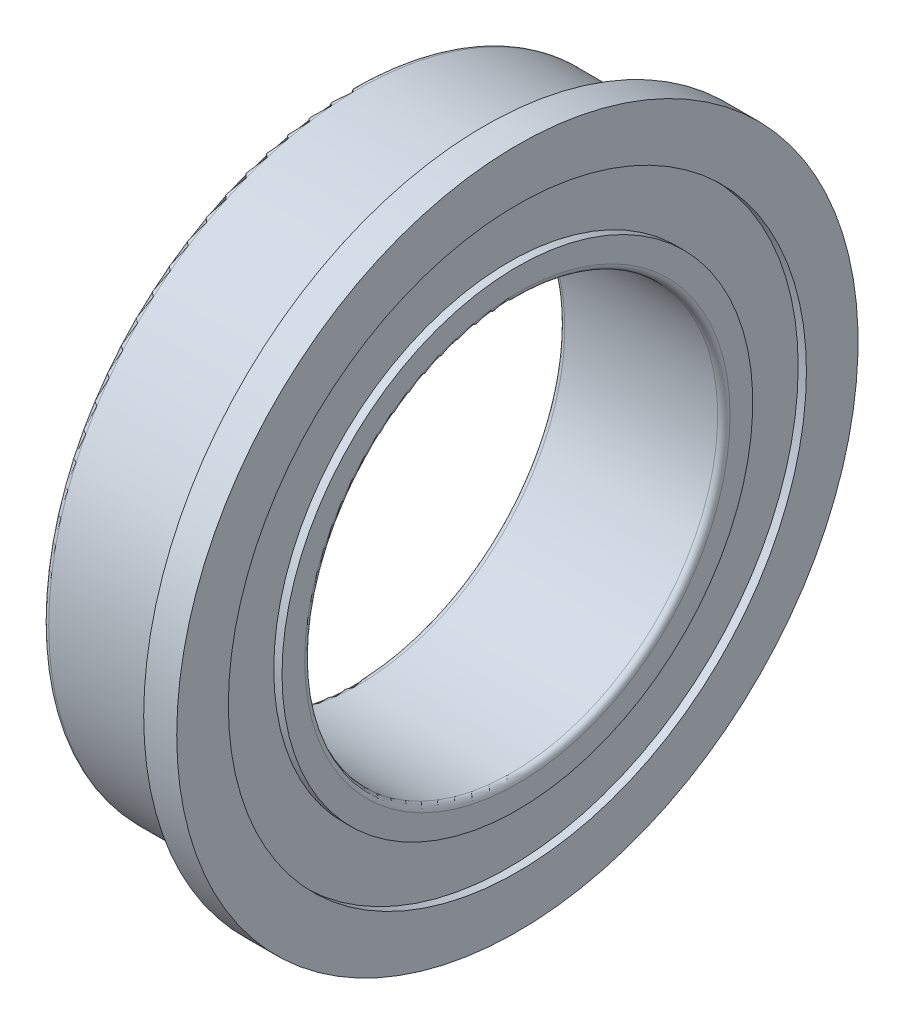
ISO-10303-21;
HEADER;
FILE_DESCRIPTION(('STEP AP214'),'2;1');
FILE_NAME('part.step','',(''),(''),'','','');
FILE_SCHEMA(('AUTOMOTIVE_DESIGN { 1 0 10303 214 1 1 1 1 }'));
ENDSEC;
DATA;
#1=APPLICATION_CONTEXT('core data for automotive mechanical design processes');
#2=APPLICATION_PROTOCOL_DEFINITION('international standard','automotive_design',2000,#1);
#3=PRODUCT_CONTEXT('',#1,'mechanical');
#4=PRODUCT('Part','Part','',(#3));
#5=PRODUCT_RELATED_PRODUCT_CATEGORY('part','',(#4));
#6=PRODUCT_DEFINITION_FORMATION('','',#4);
#7=PRODUCT_DEFINITION_CONTEXT('part definition',#1,'design');
#8=PRODUCT_DEFINITION('design','',#6,#7);
#9=PRODUCT_DEFINITION_SHAPE('','',#8);
#10=(LENGTH_UNIT() NAMED_UNIT(*) SI_UNIT(.MILLI.,.METRE.));
#11=(NAMED_UNIT(*) PLANE_ANGLE_UNIT() SI_UNIT($,.RADIAN.));
#12=(NAMED_UNIT(*) SI_UNIT($,.STERADIAN.) SOLID_ANGLE_UNIT());
#13=UNCERTAINTY_MEASURE_WITH_UNIT(LENGTH_MEASURE(1.E-05),#10,'distance_accuracy_value','');
#14=(GEOMETRIC_REPRESENTATION_CONTEXT(3) GLOBAL_UNCERTAINTY_ASSIGNED_CONTEXT((#13)) GLOBAL_UNIT_ASSIGNED_CONTEXT((#10,
#11,#12)) REPRESENTATION_CONTEXT('',''));
#15=CARTESIAN_POINT('',(0.,0.,0.));
#16=DIRECTION('',(0.,0.,1.));
#17=DIRECTION('',(1.,0.,0.));
#18=AXIS2_PLACEMENT_3D('',#15,#16,#17);
#19=CARTESIAN_POINT('',(0.,-5.7,-5.7));
#20=DIRECTION('',(-1.,0.,0.));
#21=DIRECTION('',(0.,0.,1.));
#22=AXIS2_PLACEMENT_3D('',#19,#20,#21);
#23=PLANE('',#22);
#24=CARTESIAN_POINT('',(0.,0.,0.));
#25=DIRECTION('',(-1.,0.,0.));
#26=DIRECTION('',(0.,0.,-1.));
#27=AXIS2_PLACEMENT_3D('',#24,#25,#26);
#28=CIRCLE('',#27,5.7);
#29=CARTESIAN_POINT('',(0.,0.,-5.7));
#30=VERTEX_POINT('',#29);
#31=EDGE_CURVE('E74',#30,#30,#28,.F.);
#32=ORIENTED_EDGE('',*,*,#31,.F.);
#33=EDGE_LOOP('',(#32));
#34=FACE_BOUND('',#33,.T.);
#35=CARTESIAN_POINT('',(0.,0.,0.));
#36=DIRECTION('',(1.,0.,0.));
#37=DIRECTION('',(0.,-1.42252349101873E-07,0.99999999999999));
#38=AXIS2_PLACEMENT_3D('',#35,#36,#37);
#39=CIRCLE('',#38,5.15);
#40=CARTESIAN_POINT('',(0.,-7.32599597874646E-07,5.14999999999995));
#41=VERTEX_POINT('',#40);
#42=EDGE_CURVE('E71',#41,#41,#39,.T.);
#43=ORIENTED_EDGE('',*,*,#42,.T.);
#44=EDGE_LOOP('',(#43));
#45=FACE_BOUND('',#44,.T.);
#46=ADVANCED_FACE('F15',(#34,#45),#23,.T.);
#47=CARTESIAN_POINT('',(4.,-5.7,5.7));
#48=DIRECTION('',(1.,0.,0.));
#49=DIRECTION('',(0.,0.,-1.));
#50=AXIS2_PLACEMENT_3D('',#47,#48,#49);
#51=PLANE('',#50);
#52=CARTESIAN_POINT('',(4.,0.,0.));
#53=DIRECTION('',(1.,0.,0.));
#54=DIRECTION('',(0.,0.,1.));
#55=AXIS2_PLACEMENT_3D('',#52,#53,#54);
#56=CIRCLE('',#55,5.7);
#57=CARTESIAN_POINT('',(4.,0.,5.7));
#58=VERTEX_POINT('',#57);
#59=EDGE_CURVE('E68',#58,#58,#56,.T.);
#60=ORIENTED_EDGE('',*,*,#59,.T.);
#61=EDGE_LOOP('',(#60));
#62=FACE_BOUND('',#61,.T.);
#63=CARTESIAN_POINT('',(4.,0.,0.));
#64=DIRECTION('',(-1.,0.,0.));
#65=DIRECTION('',(0.,0.,-1.));
#66=AXIS2_PLACEMENT_3D('',#63,#64,#65);
#67=CIRCLE('',#66,5.15000002888476);
#68=CARTESIAN_POINT('',(4.,0.,-5.15000002888476));
#69=VERTEX_POINT('',#68);
#70=EDGE_CURVE('E65',#69,#69,#67,.F.);
#71=ORIENTED_EDGE('',*,*,#70,.F.);
#72=EDGE_LOOP('',(#71));
#73=FACE_BOUND('',#72,.T.);
#74=ADVANCED_FACE('F82',(#62,#73),#51,.T.);
#75=CARTESIAN_POINT('',(3.8,-7.19126770361165,7.));
#76=DIRECTION('',(1.,0.,0.));
#77=DIRECTION('',(0.,0.,-1.));
#78=AXIS2_PLACEMENT_3D('',#75,#76,#77);
#79=PLANE('',#78);
#80=CARTESIAN_POINT('',(3.8,0.,0.));
#81=DIRECTION('',(1.,0.,0.));
#82=DIRECTION('',(0.,0.,1.));
#83=AXIS2_PLACEMENT_3D('',#80,#81,#82);
#84=CIRCLE('',#83,7.);
#85=CARTESIAN_POINT('',(3.8,0.,7.));
#86=VERTEX_POINT('',#85);
#87=EDGE_CURVE('E62',#86,#86,#84,.T.);
#88=ORIENTED_EDGE('',*,*,#87,.T.);
#89=EDGE_LOOP('',(#88));
#90=FACE_BOUND('',#89,.T.);
#91=CARTESIAN_POINT('',(3.8,0.,0.));
#92=DIRECTION('',(-1.,0.,0.));
#93=DIRECTION('',(0.,0.,-1.));
#94=AXIS2_PLACEMENT_3D('',#91,#92,#93);
#95=CIRCLE('',#94,5.7);
#96=CARTESIAN_POINT('',(3.8,0.,-5.7));
#97=VERTEX_POINT('',#96);
#98=EDGE_CURVE('E59',#97,#97,#95,.F.);
#99=ORIENTED_EDGE('',*,*,#98,.F.);
#100=EDGE_LOOP('',(#99));
#101=FACE_BOUND('',#100,.T.);
#102=ADVANCED_FACE('F153',(#90,#101),#79,.T.);
#103=CARTESIAN_POINT('',(4.,-8.47542263661501,8.25));
#104=DIRECTION('',(1.,0.,0.));
#105=DIRECTION('',(0.,0.,-1.));
#106=AXIS2_PLACEMENT_3D('',#103,#104,#105);
#107=PLANE('',#106);
#108=CARTESIAN_POINT('',(4.,0.,0.));
#109=DIRECTION('',(1.,0.,0.));
#110=DIRECTION('',(0.,-1.16847870100228E-09,1.));
#111=AXIS2_PLACEMENT_3D('',#108,#109,#110);
#112=CIRCLE('',#111,8.25);
#113=CARTESIAN_POINT('',(4.,-9.63994928326883E-09,8.25));
#114=VERTEX_POINT('',#113);
#115=EDGE_CURVE('E56',#114,#114,#112,.T.);
#116=ORIENTED_EDGE('',*,*,#115,.T.);
#117=EDGE_LOOP('',(#116));
#118=FACE_BOUND('',#117,.T.);
#119=CARTESIAN_POINT('',(4.,0.,0.));
#120=DIRECTION('',(-1.,0.,0.));
#121=DIRECTION('',(0.,0.,-1.));
#122=AXIS2_PLACEMENT_3D('',#119,#120,#121);
#123=CIRCLE('',#122,7.);
#124=CARTESIAN_POINT('',(4.,0.,-7.));
#125=VERTEX_POINT('',#124);
#126=EDGE_CURVE('E53',#125,#125,#123,.F.);
#127=ORIENTED_EDGE('',*,*,#126,.F.);
#128=EDGE_LOOP('',(#127));
#129=FACE_BOUND('',#128,.T.);
#130=ADVANCED_FACE('F146',(#118,#129),#107,.T.);
#131=CARTESIAN_POINT('',(3.2,-8.47542265068517,-8.25));
#132=DIRECTION('',(-1.,0.,0.));
#133=DIRECTION('',(0.,0.,1.));
#134=AXIS2_PLACEMENT_3D('',#131,#132,#133);
#135=PLANE('',#134);
#136=CARTESIAN_POINT('',(3.2,0.,0.));
#137=DIRECTION('',(-1.,0.,0.));
#138=DIRECTION('',(0.,0.,-1.));
#139=AXIS2_PLACEMENT_3D('',#136,#137,#138);
#140=CIRCLE('',#139,8.25);
#141=CARTESIAN_POINT('',(3.2,0.,-8.25));
#142=VERTEX_POINT('',#141);
#143=EDGE_CURVE('E50',#142,#142,#140,.F.);
#144=ORIENTED_EDGE('',*,*,#143,.F.);
#145=EDGE_LOOP('',(#144));
#146=FACE_BOUND('',#145,.T.);
#147=CARTESIAN_POINT('',(3.2,0.,0.));
#148=DIRECTION('',(1.,0.,0.));
#149=DIRECTION('',(0.,-1.16849751370835E-09,1.));
#150=AXIS2_PLACEMENT_3D('',#147,#148,#149);
#151=CIRCLE('',#150,7.65000000000001);
#152=CARTESIAN_POINT('',(3.2,-8.93900597986886E-09,7.65000000000001));
#153=VERTEX_POINT('',#152);
#154=EDGE_CURVE('E47',#153,#153,#151,.T.);
#155=ORIENTED_EDGE('',*,*,#154,.T.);
#156=EDGE_LOOP('',(#155));
#157=FACE_BOUND('',#156,.T.);
#158=ADVANCED_FACE('F141',(#146,#157),#135,.T.);
#159=CARTESIAN_POINT('',(0.,-7.55083108438204,-7.35));
#160=DIRECTION('',(-1.,0.,0.));
#161=DIRECTION('',(0.,0.,1.));
#162=AXIS2_PLACEMENT_3D('',#159,#160,#161);
#163=PLANE('',#162);
#164=CARTESIAN_POINT('',(0.,0.,0.));
#165=DIRECTION('',(-1.,0.,0.));
#166=DIRECTION('',(0.,0.,-1.));
#167=AXIS2_PLACEMENT_3D('',#164,#165,#166);
#168=CIRCLE('',#167,7.35);
#169=CARTESIAN_POINT('',(0.,0.,-7.35));
#170=VERTEX_POINT('',#169);
#171=EDGE_CURVE('E44',#170,#170,#168,.F.);
#172=ORIENTED_EDGE('',*,*,#171,.F.);
#173=EDGE_LOOP('',(#172));
#174=FACE_BOUND('',#173,.T.);
#175=CARTESIAN_POINT('',(0.,0.,0.));
#176=DIRECTION('',(1.,0.,0.));
#177=DIRECTION('',(0.,0.,1.));
#178=AXIS2_PLACEMENT_3D('',#175,#176,#177);
#179=CIRCLE('',#178,7.);
#180=CARTESIAN_POINT('',(0.,0.,7.));
#181=VERTEX_POINT('',#180);
#182=EDGE_CURVE('E41',#181,#181,#179,.T.);
#183=ORIENTED_EDGE('',*,*,#182,.T.);
#184=EDGE_LOOP('',(#183));
#185=FACE_BOUND('',#184,.T.);
#186=ADVANCED_FACE('F100',(#174,#185),#163,.T.);
#187=CARTESIAN_POINT('',(0.2,-7.19126770361165,-7.));
#188=DIRECTION('',(-1.,0.,0.));
#189=DIRECTION('',(0.,0.,1.));
#190=AXIS2_PLACEMENT_3D('',#187,#188,#189);
#191=PLANE('',#190);
#192=CARTESIAN_POINT('',(0.2,0.,0.));
#193=DIRECTION('',(-1.,0.,0.));
#194=DIRECTION('',(0.,0.,-1.));
#195=AXIS2_PLACEMENT_3D('',#192,#193,#194);
#196=CIRCLE('',#195,7.);
#197=CARTESIAN_POINT('',(0.2,0.,-7.));
#198=VERTEX_POINT('',#197);
#199=EDGE_CURVE('E38',#198,#198,#196,.F.);
#200=ORIENTED_EDGE('',*,*,#199,.F.);
#201=EDGE_LOOP('',(#200));
#202=FACE_BOUND('',#201,.T.);
#203=CARTESIAN_POINT('',(0.2,0.,0.));
#204=DIRECTION('',(1.,0.,0.));
#205=DIRECTION('',(0.,0.,1.));
#206=AXIS2_PLACEMENT_3D('',#203,#204,#205);
#207=CIRCLE('',#206,5.7);
#208=CARTESIAN_POINT('',(0.2,0.,5.7));
#209=VERTEX_POINT('',#208);
#210=EDGE_CURVE('E35',#209,#209,#207,.T.);
#211=ORIENTED_EDGE('',*,*,#210,.T.);
#212=EDGE_LOOP('',(#211));
#213=FACE_BOUND('',#212,.T.);
#214=ADVANCED_FACE('F89',(#202,#213),#191,.T.);
#215=CARTESIAN_POINT('',(0.149999999999969,0.,0.));
#216=DIRECTION('',(1.,0.,0.));
#217=DIRECTION('',(0.,0.,1.));
#218=AXIS2_PLACEMENT_3D('',#215,#216,#217);
#219=TOROIDAL_SURFACE('',#218,5.15,0.149999999999969);
#220=CARTESIAN_POINT('',(0.15,0.,0.));
#221=DIRECTION('',(1.,0.,0.));
#222=DIRECTION('',(0.,0.,1.));
#223=AXIS2_PLACEMENT_3D('',#220,#221,#222);
#224=CIRCLE('',#223,5.00000000000003);
#225=CARTESIAN_POINT('',(0.15,0.,5.00000000000003));
#226=VERTEX_POINT('',#225);
#227=EDGE_CURVE('E30',#226,#226,#224,.T.);
#228=ORIENTED_EDGE('',*,*,#227,.T.);
#229=EDGE_LOOP('',(#228));
#230=FACE_BOUND('',#229,.T.);
#231=ORIENTED_EDGE('',*,*,#42,.F.);
#232=EDGE_LOOP('',(#231));
#233=FACE_BOUND('',#232,.T.);
#234=ADVANCED_FACE('F86',(#230,#233),#219,.T.);
#235=CARTESIAN_POINT('',(15.,0.,0.));
#236=DIRECTION('',(1.,0.,0.));
#237=DIRECTION('',(0.,0.,1.));
#238=AXIS2_PLACEMENT_3D('',#235,#236,#237);
#239=CYLINDRICAL_SURFACE('',#238,5.);
#240=CARTESIAN_POINT('',(3.85,0.,0.));
#241=DIRECTION('',(1.,0.,0.));
#242=DIRECTION('',(0.,0.,1.));
#243=AXIS2_PLACEMENT_3D('',#240,#241,#242);
#244=CIRCLE('',#243,5.);
#245=CARTESIAN_POINT('',(3.85,0.,5.));
#246=VERTEX_POINT('',#245);
#247=EDGE_CURVE('E26',#246,#246,#244,.T.);
#248=ORIENTED_EDGE('',*,*,#247,.T.);
#249=EDGE_LOOP('',(#248));
#250=FACE_BOUND('',#249,.T.);
#251=ORIENTED_EDGE('',*,*,#227,.F.);
#252=EDGE_LOOP('',(#251));
#253=FACE_BOUND('',#252,.T.);
#254=ADVANCED_FACE('F88',(#250,#253),#239,.F.);
#255=CARTESIAN_POINT('',(3.85000000000007,0.,0.));
#256=DIRECTION('',(1.,0.,0.));
#257=DIRECTION('',(0.,1.42139942161175E-07,0.99999999999999));
#258=AXIS2_PLACEMENT_3D('',#255,#256,#257);
#259=TOROIDAL_SURFACE('',#258,5.14999999999994,0.149999999999937);
#260=ORIENTED_EDGE('',*,*,#70,.T.);
#261=EDGE_LOOP('',(#260));
#262=FACE_BOUND('',#261,.T.);
#263=ORIENTED_EDGE('',*,*,#247,.F.);
#264=EDGE_LOOP('',(#263));
#265=FACE_BOUND('',#264,.T.);
#266=ADVANCED_FACE('F97',(#262,#265),#259,.T.);
#267=CARTESIAN_POINT('',(15.,0.,0.));
#268=DIRECTION('',(1.,0.,0.));
#269=DIRECTION('',(0.,0.,1.));
#270=AXIS2_PLACEMENT_3D('',#267,#268,#269);
#271=CYLINDRICAL_SURFACE('',#270,5.7);
#272=ORIENTED_EDGE('',*,*,#98,.T.);
#273=EDGE_LOOP('',(#272));
#274=FACE_BOUND('',#273,.T.);
#275=ORIENTED_EDGE('',*,*,#59,.F.);
#276=EDGE_LOOP('',(#275));
#277=FACE_BOUND('',#276,.T.);
#278=ADVANCED_FACE('F107',(#274,#277),#271,.T.);
#279=CARTESIAN_POINT('',(15.,0.,0.));
#280=DIRECTION('',(1.,0.,0.));
#281=DIRECTION('',(0.,0.,1.));
#282=AXIS2_PLACEMENT_3D('',#279,#280,#281);
#283=CYLINDRICAL_SURFACE('',#282,7.);
#284=ORIENTED_EDGE('',*,*,#126,.T.);
#285=EDGE_LOOP('',(#284));
#286=FACE_BOUND('',#285,.T.);
#287=ORIENTED_EDGE('',*,*,#87,.F.);
#288=EDGE_LOOP('',(#287));
#289=FACE_BOUND('',#288,.T.);
#290=ADVANCED_FACE('F111',(#286,#289),#283,.F.);
#291=CARTESIAN_POINT('',(15.,0.,0.));
#292=DIRECTION('',(1.,0.,0.));
#293=DIRECTION('',(0.,0.,1.));
#294=AXIS2_PLACEMENT_3D('',#291,#292,#293);
#295=CYLINDRICAL_SURFACE('',#294,8.25);
#296=ORIENTED_EDGE('',*,*,#143,.T.);
#297=EDGE_LOOP('',(#296));
#298=FACE_BOUND('',#297,.T.);
#299=ORIENTED_EDGE('',*,*,#115,.F.);
#300=EDGE_LOOP('',(#299));
#301=FACE_BOUND('',#300,.T.);
#302=ADVANCED_FACE('F115',(#298,#301),#295,.T.);
#303=CARTESIAN_POINT('',(3.2,0.,0.));
#304=DIRECTION('',(1.,0.,0.));
#305=DIRECTION('',(0.,0.,1.));
#306=AXIS2_PLACEMENT_3D('',#303,#304,#305);
#307=TOROIDAL_SURFACE('',#306,7.5,0.150000000000011);
#308=ORIENTED_EDGE('',*,*,#154,.F.);
#309=EDGE_LOOP('',(#308));
#310=FACE_BOUND('',#309,.T.);
#311=CARTESIAN_POINT('',(3.04999999999999,0.,0.));
#312=DIRECTION('',(1.,0.,0.));
#313=DIRECTION('',(0.,0.,1.));
#314=AXIS2_PLACEMENT_3D('',#311,#312,#313);
#315=CIRCLE('',#314,7.5);
#316=CARTESIAN_POINT('',(3.04999999999999,0.,7.5));
#317=VERTEX_POINT('',#316);
#318=EDGE_CURVE('E22',#317,#317,#315,.T.);
#319=ORIENTED_EDGE('',*,*,#318,.T.);
#320=EDGE_LOOP('',(#319));
#321=FACE_BOUND('',#320,.T.);
#322=ADVANCED_FACE('F119',(#310,#321),#307,.F.);
#323=CARTESIAN_POINT('',(15.,0.,0.));
#324=DIRECTION('',(1.,0.,0.));
#325=DIRECTION('',(0.,0.,1.));
#326=AXIS2_PLACEMENT_3D('',#323,#324,#325);
#327=CYLINDRICAL_SURFACE('',#326,7.5);
#328=CARTESIAN_POINT('',(0.149999999999984,0.,0.));
#329=DIRECTION('',(1.,0.,0.));
#330=DIRECTION('',(0.,0.,1.));
#331=AXIS2_PLACEMENT_3D('',#328,#329,#330);
#332=CIRCLE('',#331,7.5);
#333=CARTESIAN_POINT('',(0.149999999999984,0.,7.5));
#334=VERTEX_POINT('',#333);
#335=EDGE_CURVE('E10',#334,#334,#332,.T.);
#336=ORIENTED_EDGE('',*,*,#335,.T.);
#337=EDGE_LOOP('',(#336));
#338=FACE_BOUND('',#337,.T.);
#339=ORIENTED_EDGE('',*,*,#318,.F.);
#340=EDGE_LOOP('',(#339));
#341=FACE_BOUND('',#340,.T.);
#342=ADVANCED_FACE('F123',(#338,#341),#327,.T.);
#343=CARTESIAN_POINT('',(0.149999999999968,0.,0.));
#344=DIRECTION('',(1.,0.,0.));
#345=DIRECTION('',(0.,1.16855781751732E-09,1.));
#346=AXIS2_PLACEMENT_3D('',#343,#344,#345);
#347=TOROIDAL_SURFACE('',#346,7.35,0.149999999999968);
#348=ORIENTED_EDGE('',*,*,#171,.T.);
#349=EDGE_LOOP('',(#348));
#350=FACE_BOUND('',#349,.T.);
#351=ORIENTED_EDGE('',*,*,#335,.F.);
#352=EDGE_LOOP('',(#351));
#353=FACE_BOUND('',#352,.T.);
#354=ADVANCED_FACE('F127',(#350,#353),#347,.T.);
#355=CARTESIAN_POINT('',(15.,0.,0.));
#356=DIRECTION('',(1.,0.,0.));
#357=DIRECTION('',(0.,0.,1.));
#358=AXIS2_PLACEMENT_3D('',#355,#356,#357);
#359=CYLINDRICAL_SURFACE('',#358,7.);
#360=ORIENTED_EDGE('',*,*,#199,.T.);
#361=EDGE_LOOP('',(#360));
#362=FACE_BOUND('',#361,.T.);
#363=ORIENTED_EDGE('',*,*,#182,.F.);
#364=EDGE_LOOP('',(#363));
#365=FACE_BOUND('',#364,.T.);
#366=ADVANCED_FACE('F129',(#362,#365),#359,.F.);
#367=CARTESIAN_POINT('',(15.,0.,0.));
#368=DIRECTION('',(1.,0.,0.));
#369=DIRECTION('',(0.,0.,1.));
#370=AXIS2_PLACEMENT_3D('',#367,#368,#369);
#371=CYLINDRICAL_SURFACE('',#370,5.7);
#372=ORIENTED_EDGE('',*,*,#31,.T.);
#373=EDGE_LOOP('',(#372));
#374=FACE_BOUND('',#373,.T.);
#375=ORIENTED_EDGE('',*,*,#210,.F.);
#376=EDGE_LOOP('',(#375));
#377=FACE_BOUND('',#376,.T.);
#378=ADVANCED_FACE('F17',(#374,#377),#371,.T.);
#379=CLOSED_SHELL('',(#46,#74,#102,#130,#158,#186,#214,#234,#254,#266,#278,#290,#302,#322,#342,
#354,#366,#378));
#380=MANIFOLD_SOLID_BREP('B1',#379);
#381=ADVANCED_BREP_SHAPE_REPRESENTATION('',(#18,#380),#14);
#382=SHAPE_DEFINITION_REPRESENTATION(#9,#381);
ENDSEC;
END-ISO-10303-21;
